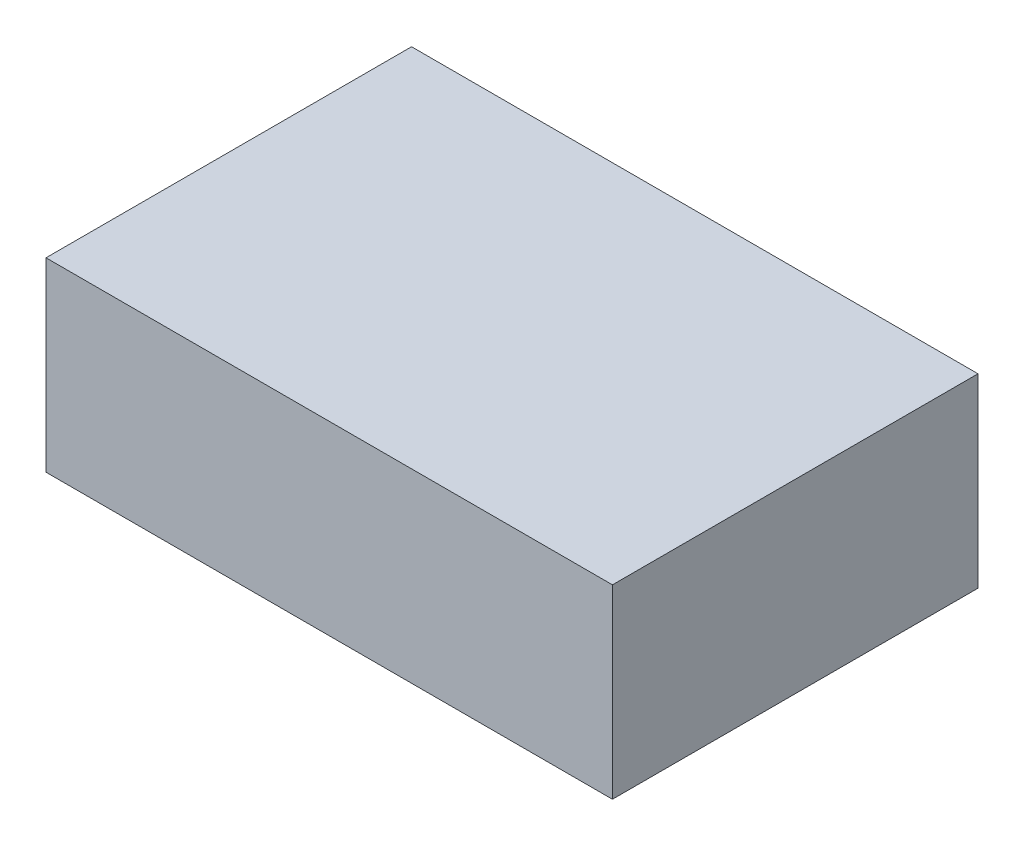
ISO-10303-21;
HEADER;
FILE_DESCRIPTION(('STEP AP214'),'2;1');
FILE_NAME('part.step','',(''),(''),'','','');
FILE_SCHEMA(('AUTOMOTIVE_DESIGN { 1 0 10303 214 1 1 1 1 }'));
ENDSEC;
DATA;
#1=APPLICATION_CONTEXT('core data for automotive mechanical design processes');
#2=APPLICATION_PROTOCOL_DEFINITION('international standard','automotive_design',2000,#1);
#3=PRODUCT_CONTEXT('',#1,'mechanical');
#4=PRODUCT('Part','Part','',(#3));
#5=PRODUCT_RELATED_PRODUCT_CATEGORY('part','',(#4));
#6=PRODUCT_DEFINITION_FORMATION('','',#4);
#7=PRODUCT_DEFINITION_CONTEXT('part definition',#1,'design');
#8=PRODUCT_DEFINITION('design','',#6,#7);
#9=PRODUCT_DEFINITION_SHAPE('','',#8);
#10=(LENGTH_UNIT() NAMED_UNIT(*) SI_UNIT(.MILLI.,.METRE.));
#11=(NAMED_UNIT(*) PLANE_ANGLE_UNIT() SI_UNIT($,.RADIAN.));
#12=(NAMED_UNIT(*) SI_UNIT($,.STERADIAN.) SOLID_ANGLE_UNIT());
#13=UNCERTAINTY_MEASURE_WITH_UNIT(LENGTH_MEASURE(1.E-05),#10,'distance_accuracy_value','');
#14=(GEOMETRIC_REPRESENTATION_CONTEXT(3) GLOBAL_UNCERTAINTY_ASSIGNED_CONTEXT((#13)) GLOBAL_UNIT_ASSIGNED_CONTEXT((#10,
#11,#12)) REPRESENTATION_CONTEXT('',''));
#15=CARTESIAN_POINT('',(0.,0.,0.));
#16=DIRECTION('',(0.,0.,1.));
#17=DIRECTION('',(1.,0.,0.));
#18=AXIS2_PLACEMENT_3D('',#15,#16,#17);
#19=CARTESIAN_POINT('',(-9.15,3.,11.81));
#20=DIRECTION('',(1.,0.,0.));
#21=DIRECTION('',(0.,0.,-1.));
#22=AXIS2_PLACEMENT_3D('',#19,#20,#21);
#23=PLANE('',#22);
#24=DIRECTION('',(0.,-1.,0.));
#25=VECTOR('',#24,1.);
#26=CARTESIAN_POINT('',(-9.15,3.,0.));
#27=LINE('',#26,#25);
#28=CARTESIAN_POINT('',(-9.15,3.,0.));
#29=VERTEX_POINT('',#28);
#30=CARTESIAN_POINT('',(-9.15,-3.,0.));
#31=VERTEX_POINT('',#30);
#32=EDGE_CURVE('E96',#29,#31,#27,.T.);
#33=ORIENTED_EDGE('',*,*,#32,.T.);
#34=DIRECTION('',(0.,0.,-1.));
#35=VECTOR('',#34,1.);
#36=CARTESIAN_POINT('',(-9.15,-3.,11.81));
#37=LINE('',#36,#35);
#38=CARTESIAN_POINT('',(-9.15,-3.,11.81));
#39=VERTEX_POINT('',#38);
#40=EDGE_CURVE('E11',#39,#31,#37,.T.);
#41=ORIENTED_EDGE('',*,*,#40,.F.);
#42=DIRECTION('',(0.,-1.,0.));
#43=VECTOR('',#42,1.);
#44=CARTESIAN_POINT('',(-9.15,3.,11.81));
#45=LINE('',#44,#43);
#46=CARTESIAN_POINT('',(-9.15,3.,11.81));
#47=VERTEX_POINT('',#46);
#48=EDGE_CURVE('E84',#47,#39,#45,.T.);
#49=ORIENTED_EDGE('',*,*,#48,.F.);
#50=DIRECTION('',(0.,0.,-1.));
#51=VECTOR('',#50,1.);
#52=CARTESIAN_POINT('',(-9.15,3.,11.81));
#53=LINE('',#52,#51);
#54=EDGE_CURVE('E92',#47,#29,#53,.T.);
#55=ORIENTED_EDGE('',*,*,#54,.T.);
#56=EDGE_LOOP('',(#33,#41,#49,#55));
#57=FACE_BOUND('',#56,.T.);
#58=ADVANCED_FACE('F33',(#57),#23,.F.);
#59=CARTESIAN_POINT('',(-9.15,-3.,11.81));
#60=DIRECTION('',(0.,1.,0.));
#61=DIRECTION('',(0.,0.,1.));
#62=AXIS2_PLACEMENT_3D('',#59,#60,#61);
#63=PLANE('',#62);
#64=DIRECTION('',(1.,0.,0.));
#65=VECTOR('',#64,1.);
#66=CARTESIAN_POINT('',(-9.15,-3.,0.));
#67=LINE('',#66,#65);
#68=CARTESIAN_POINT('',(9.15,-3.,0.));
#69=VERTEX_POINT('',#68);
#70=EDGE_CURVE('E88',#31,#69,#67,.T.);
#71=ORIENTED_EDGE('',*,*,#70,.T.);
#72=DIRECTION('',(0.,0.,-1.));
#73=VECTOR('',#72,1.);
#74=CARTESIAN_POINT('',(9.15,-3.,11.81));
#75=LINE('',#74,#73);
#76=CARTESIAN_POINT('',(9.15,-3.,11.81));
#77=VERTEX_POINT('',#76);
#78=EDGE_CURVE('E41',#77,#69,#75,.T.);
#79=ORIENTED_EDGE('',*,*,#78,.F.);
#80=DIRECTION('',(1.,0.,0.));
#81=VECTOR('',#80,1.);
#82=CARTESIAN_POINT('',(-9.15,-3.,11.81));
#83=LINE('',#82,#81);
#84=EDGE_CURVE('E79',#39,#77,#83,.T.);
#85=ORIENTED_EDGE('',*,*,#84,.F.);
#86=ORIENTED_EDGE('',*,*,#40,.T.);
#87=EDGE_LOOP('',(#71,#79,#85,#86));
#88=FACE_BOUND('',#87,.T.);
#89=ADVANCED_FACE('F87',(#88),#63,.F.);
#90=CARTESIAN_POINT('',(9.15,-3.,11.81));
#91=DIRECTION('',(-1.,0.,0.));
#92=DIRECTION('',(0.,0.,1.));
#93=AXIS2_PLACEMENT_3D('',#90,#91,#92);
#94=PLANE('',#93);
#95=DIRECTION('',(0.,1.,0.));
#96=VECTOR('',#95,1.);
#97=CARTESIAN_POINT('',(9.15,-3.,0.));
#98=LINE('',#97,#96);
#99=CARTESIAN_POINT('',(9.15,3.,0.));
#100=VERTEX_POINT('',#99);
#101=EDGE_CURVE('E66',#69,#100,#98,.T.);
#102=ORIENTED_EDGE('',*,*,#101,.T.);
#103=DIRECTION('',(0.,0.,-1.));
#104=VECTOR('',#103,1.);
#105=CARTESIAN_POINT('',(9.15,3.,11.81));
#106=LINE('',#105,#104);
#107=CARTESIAN_POINT('',(9.15,3.,11.81));
#108=VERTEX_POINT('',#107);
#109=EDGE_CURVE('E89',#108,#100,#106,.T.);
#110=ORIENTED_EDGE('',*,*,#109,.F.);
#111=DIRECTION('',(0.,1.,0.));
#112=VECTOR('',#111,1.);
#113=CARTESIAN_POINT('',(9.15,-3.,11.81));
#114=LINE('',#113,#112);
#115=EDGE_CURVE('E82',#77,#108,#114,.T.);
#116=ORIENTED_EDGE('',*,*,#115,.F.);
#117=ORIENTED_EDGE('',*,*,#78,.T.);
#118=EDGE_LOOP('',(#102,#110,#116,#117));
#119=FACE_BOUND('',#118,.T.);
#120=ADVANCED_FACE('F90',(#119),#94,.F.);
#121=CARTESIAN_POINT('',(9.15,3.,11.81));
#122=DIRECTION('',(0.,-1.,0.));
#123=DIRECTION('',(0.,0.,-1.));
#124=AXIS2_PLACEMENT_3D('',#121,#122,#123);
#125=PLANE('',#124);
#126=DIRECTION('',(-1.,0.,0.));
#127=VECTOR('',#126,1.);
#128=CARTESIAN_POINT('',(9.15,3.,0.));
#129=LINE('',#128,#127);
#130=EDGE_CURVE('E72',#100,#29,#129,.T.);
#131=ORIENTED_EDGE('',*,*,#130,.T.);
#132=ORIENTED_EDGE('',*,*,#54,.F.);
#133=DIRECTION('',(-1.,0.,0.));
#134=VECTOR('',#133,1.);
#135=CARTESIAN_POINT('',(9.15,3.,11.81));
#136=LINE('',#135,#134);
#137=EDGE_CURVE('E49',#108,#47,#136,.T.);
#138=ORIENTED_EDGE('',*,*,#137,.F.);
#139=ORIENTED_EDGE('',*,*,#109,.T.);
#140=EDGE_LOOP('',(#131,#132,#138,#139));
#141=FACE_BOUND('',#140,.T.);
#142=ADVANCED_FACE('F103',(#141),#125,.F.);
#143=CARTESIAN_POINT('',(0.,0.,11.81));
#144=DIRECTION('',(0.,0.,1.));
#145=DIRECTION('',(1.,0.,0.));
#146=AXIS2_PLACEMENT_3D('',#143,#144,#145);
#147=PLANE('',#146);
#148=ORIENTED_EDGE('',*,*,#48,.T.);
#149=ORIENTED_EDGE('',*,*,#84,.T.);
#150=ORIENTED_EDGE('',*,*,#115,.T.);
#151=ORIENTED_EDGE('',*,*,#137,.T.);
#152=EDGE_LOOP('',(#148,#149,#150,#151));
#153=FACE_BOUND('',#152,.T.);
#154=ADVANCED_FACE('F80',(#153),#147,.T.);
#155=CARTESIAN_POINT('',(0.,0.,0.));
#156=DIRECTION('',(0.,0.,1.));
#157=DIRECTION('',(1.,0.,0.));
#158=AXIS2_PLACEMENT_3D('',#155,#156,#157);
#159=PLANE('',#158);
#160=ORIENTED_EDGE('',*,*,#32,.F.);
#161=ORIENTED_EDGE('',*,*,#130,.F.);
#162=ORIENTED_EDGE('',*,*,#101,.F.);
#163=ORIENTED_EDGE('',*,*,#70,.F.);
#164=EDGE_LOOP('',(#160,#161,#162,#163));
#165=FACE_BOUND('',#164,.T.);
#166=ADVANCED_FACE('F106',(#165),#159,.F.);
#167=CLOSED_SHELL('',(#58,#89,#120,#142,#154,#166));
#168=MANIFOLD_SOLID_BREP('B2',#167);
#169=ADVANCED_BREP_SHAPE_REPRESENTATION('',(#18,#168),#14);
#170=SHAPE_DEFINITION_REPRESENTATION(#9,#169);
ENDSEC;
END-ISO-10303-21;
